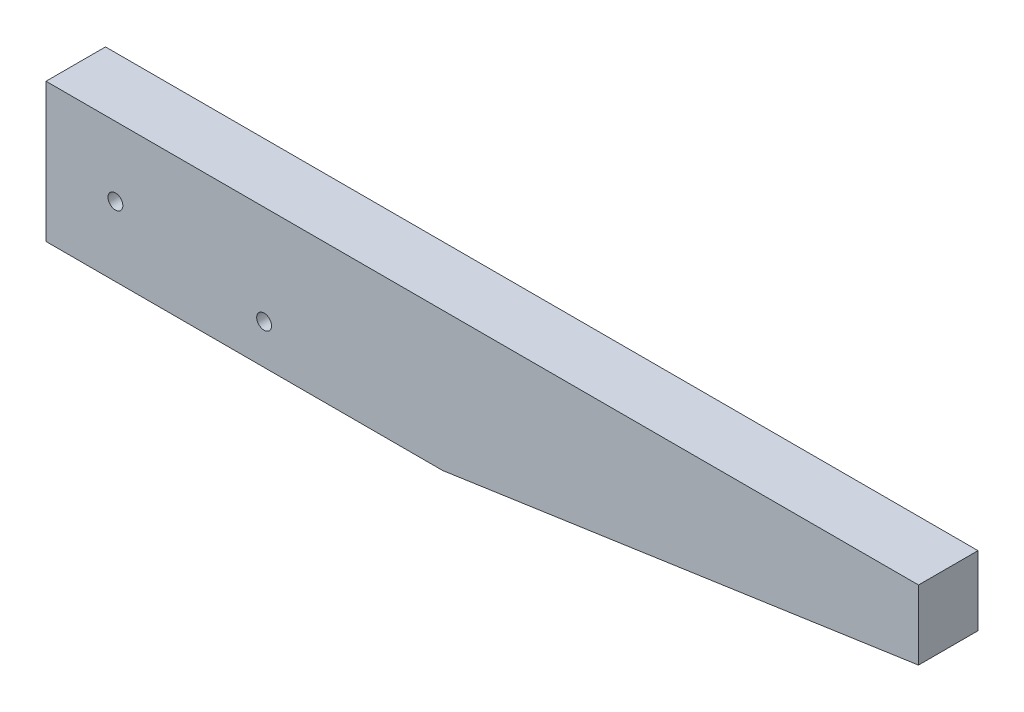
ISO-10303-21;
HEADER;
FILE_DESCRIPTION(('STEP AP214'),'2;1');
FILE_NAME('part.step','',(''),(''),'','','');
FILE_SCHEMA(('AUTOMOTIVE_DESIGN { 1 0 10303 214 1 1 1 1 }'));
ENDSEC;
DATA;
#1=APPLICATION_CONTEXT('core data for automotive mechanical design processes');
#2=APPLICATION_PROTOCOL_DEFINITION('international standard','automotive_design',2000,#1);
#3=PRODUCT_CONTEXT('',#1,'mechanical');
#4=PRODUCT('Part','Part','',(#3));
#5=PRODUCT_RELATED_PRODUCT_CATEGORY('part','',(#4));
#6=PRODUCT_DEFINITION_FORMATION('','',#4);
#7=PRODUCT_DEFINITION_CONTEXT('part definition',#1,'design');
#8=PRODUCT_DEFINITION('design','',#6,#7);
#9=PRODUCT_DEFINITION_SHAPE('','',#8);
#10=(LENGTH_UNIT() NAMED_UNIT(*) SI_UNIT(.MILLI.,.METRE.));
#11=(NAMED_UNIT(*) PLANE_ANGLE_UNIT() SI_UNIT($,.RADIAN.));
#12=(NAMED_UNIT(*) SI_UNIT($,.STERADIAN.) SOLID_ANGLE_UNIT());
#13=UNCERTAINTY_MEASURE_WITH_UNIT(LENGTH_MEASURE(1.E-05),#10,'distance_accuracy_value','');
#14=(GEOMETRIC_REPRESENTATION_CONTEXT(3) GLOBAL_UNCERTAINTY_ASSIGNED_CONTEXT((#13)) GLOBAL_UNIT_ASSIGNED_CONTEXT((#10,
#11,#12)) REPRESENTATION_CONTEXT('',''));
#15=CARTESIAN_POINT('',(0.,0.,0.));
#16=DIRECTION('',(0.,0.,1.));
#17=DIRECTION('',(1.,0.,0.));
#18=AXIS2_PLACEMENT_3D('',#15,#16,#17);
#19=CARTESIAN_POINT('',(0.,0.,38.1));
#20=DIRECTION('',(0.,1.,0.));
#21=DIRECTION('',(0.,0.,1.));
#22=AXIS2_PLACEMENT_3D('',#19,#20,#21);
#23=PLANE('',#22);
#24=DIRECTION('',(0.,0.,1.));
#25=VECTOR('',#24,1.);
#26=CARTESIAN_POINT('',(254.,0.,0.));
#27=LINE('',#26,#25);
#28=CARTESIAN_POINT('',(254.,0.,0.));
#29=VERTEX_POINT('',#28);
#30=CARTESIAN_POINT('',(254.,0.,38.1));
#31=VERTEX_POINT('',#30);
#32=EDGE_CURVE('E54',#29,#31,#27,.T.);
#33=ORIENTED_EDGE('',*,*,#32,.T.);
#34=DIRECTION('',(1.,0.,0.));
#35=VECTOR('',#34,1.);
#36=CARTESIAN_POINT('',(0.,0.,38.1));
#37=LINE('',#36,#35);
#38=CARTESIAN_POINT('',(0.,0.,38.1));
#39=VERTEX_POINT('',#38);
#40=EDGE_CURVE('E85',#39,#31,#37,.T.);
#41=ORIENTED_EDGE('',*,*,#40,.F.);
#42=DIRECTION('',(0.,0.,-1.));
#43=VECTOR('',#42,1.);
#44=CARTESIAN_POINT('',(0.,0.,38.1));
#45=LINE('',#44,#43);
#46=CARTESIAN_POINT('',(0.,0.,0.));
#47=VERTEX_POINT('',#46);
#48=EDGE_CURVE('E11',#39,#47,#45,.T.);
#49=ORIENTED_EDGE('',*,*,#48,.T.);
#50=DIRECTION('',(1.,0.,0.));
#51=VECTOR('',#50,1.);
#52=CARTESIAN_POINT('',(0.,0.,0.));
#53=LINE('',#52,#51);
#54=EDGE_CURVE('E115',#47,#29,#53,.T.);
#55=ORIENTED_EDGE('',*,*,#54,.T.);
#56=EDGE_LOOP('',(#33,#41,#49,#55));
#57=FACE_BOUND('',#56,.T.);
#58=ADVANCED_FACE('F38',(#57),#23,.F.);
#59=CARTESIAN_POINT('',(558.8,0.,38.1));
#60=DIRECTION('',(-1.,0.,0.));
#61=DIRECTION('',(0.,0.,1.));
#62=AXIS2_PLACEMENT_3D('',#59,#60,#61);
#63=PLANE('',#62);
#64=DIRECTION('',(0.,0.,1.));
#65=VECTOR('',#64,1.);
#66=CARTESIAN_POINT('',(558.8,44.45,0.));
#67=LINE('',#66,#65);
#68=CARTESIAN_POINT('',(558.8,44.45,0.));
#69=VERTEX_POINT('',#68);
#70=CARTESIAN_POINT('',(558.8,44.45,38.1));
#71=VERTEX_POINT('',#70);
#72=EDGE_CURVE('E95',#69,#71,#67,.T.);
#73=ORIENTED_EDGE('',*,*,#72,.F.);
#74=DIRECTION('',(0.,1.,0.));
#75=VECTOR('',#74,1.);
#76=CARTESIAN_POINT('',(558.8,0.,0.));
#77=LINE('',#76,#75);
#78=CARTESIAN_POINT('',(558.8,88.9,0.));
#79=VERTEX_POINT('',#78);
#80=EDGE_CURVE('E107',#69,#79,#77,.T.);
#81=ORIENTED_EDGE('',*,*,#80,.T.);
#82=DIRECTION('',(0.,0.,-1.));
#83=VECTOR('',#82,1.);
#84=CARTESIAN_POINT('',(558.8,88.9,38.1));
#85=LINE('',#84,#83);
#86=CARTESIAN_POINT('',(558.8,88.9,38.1));
#87=VERTEX_POINT('',#86);
#88=EDGE_CURVE('E47',#87,#79,#85,.T.);
#89=ORIENTED_EDGE('',*,*,#88,.F.);
#90=DIRECTION('',(0.,1.,0.));
#91=VECTOR('',#90,1.);
#92=CARTESIAN_POINT('',(558.8,0.,38.1));
#93=LINE('',#92,#91);
#94=EDGE_CURVE('E108',#71,#87,#93,.T.);
#95=ORIENTED_EDGE('',*,*,#94,.F.);
#96=EDGE_LOOP('',(#73,#81,#89,#95));
#97=FACE_BOUND('',#96,.T.);
#98=ADVANCED_FACE('F105',(#97),#63,.F.);
#99=CARTESIAN_POINT('',(0.,0.,38.1));
#100=DIRECTION('',(0.,0.,-1.));
#101=DIRECTION('',(-1.,0.,0.));
#102=AXIS2_PLACEMENT_3D('',#99,#100,#101);
#103=PLANE('',#102);
#104=CARTESIAN_POINT('',(139.7,25.4,38.1));
#105=DIRECTION('',(0.,0.,1.));
#106=DIRECTION('',(1.,0.,0.));
#107=AXIS2_PLACEMENT_3D('',#104,#105,#106);
#108=CIRCLE('',#107,4.76250000000001);
#109=CARTESIAN_POINT('',(144.4625,25.4,38.1));
#110=VERTEX_POINT('',#109);
#111=EDGE_CURVE('E170',#110,#110,#108,.T.);
#112=ORIENTED_EDGE('',*,*,#111,.F.);
#113=EDGE_LOOP('',(#112));
#114=FACE_BOUND('',#113,.T.);
#115=CARTESIAN_POINT('',(44.45,44.45,38.1));
#116=DIRECTION('',(0.,0.,1.));
#117=DIRECTION('',(1.,0.,0.));
#118=AXIS2_PLACEMENT_3D('',#115,#116,#117);
#119=CIRCLE('',#118,4.7625);
#120=CARTESIAN_POINT('',(49.2125,44.45,38.1));
#121=VERTEX_POINT('',#120);
#122=EDGE_CURVE('E174',#121,#121,#119,.T.);
#123=ORIENTED_EDGE('',*,*,#122,.F.);
#124=EDGE_LOOP('',(#123));
#125=FACE_BOUND('',#124,.T.);
#126=DIRECTION('',(0.989532981063282,0.144306893071729,0.));
#127=VECTOR('',#126,1.);
#128=CARTESIAN_POINT('',(5.28941776455589,-36.2702932426689,38.1));
#129=LINE('',#128,#127);
#130=EDGE_CURVE('E101',#31,#71,#129,.T.);
#131=ORIENTED_EDGE('',*,*,#130,.T.);
#132=ORIENTED_EDGE('',*,*,#94,.T.);
#133=DIRECTION('',(-1.,0.,0.));
#134=VECTOR('',#133,1.);
#135=CARTESIAN_POINT('',(0.,88.9,38.1));
#136=LINE('',#135,#134);
#137=CARTESIAN_POINT('',(0.,88.9,38.1));
#138=VERTEX_POINT('',#137);
#139=EDGE_CURVE('E63',#87,#138,#136,.T.);
#140=ORIENTED_EDGE('',*,*,#139,.T.);
#141=DIRECTION('',(0.,-1.,0.));
#142=VECTOR('',#141,1.);
#143=CARTESIAN_POINT('',(0.,0.,38.1));
#144=LINE('',#143,#142);
#145=EDGE_CURVE('E119',#138,#39,#144,.T.);
#146=ORIENTED_EDGE('',*,*,#145,.T.);
#147=ORIENTED_EDGE('',*,*,#40,.T.);
#148=EDGE_LOOP('',(#131,#132,#140,#146,#147));
#149=FACE_BOUND('',#148,.T.);
#150=ADVANCED_FACE('F142',(#114,#125,#149),#103,.F.);
#151=CARTESIAN_POINT('',(0.,0.,0.));
#152=DIRECTION('',(0.,0.,-1.));
#153=DIRECTION('',(-1.,0.,0.));
#154=AXIS2_PLACEMENT_3D('',#151,#152,#153);
#155=PLANE('',#154);
#156=CARTESIAN_POINT('',(139.7,25.4,0.));
#157=DIRECTION('',(0.,0.,1.));
#158=DIRECTION('',(1.,0.,0.));
#159=AXIS2_PLACEMENT_3D('',#156,#157,#158);
#160=CIRCLE('',#159,4.76250000000001);
#161=CARTESIAN_POINT('',(144.4625,25.4,0.));
#162=VERTEX_POINT('',#161);
#163=EDGE_CURVE('E167',#162,#162,#160,.T.);
#164=ORIENTED_EDGE('',*,*,#163,.T.);
#165=EDGE_LOOP('',(#164));
#166=FACE_BOUND('',#165,.T.);
#167=CARTESIAN_POINT('',(44.45,44.45,0.));
#168=DIRECTION('',(0.,0.,-1.));
#169=DIRECTION('',(-1.,0.,0.));
#170=AXIS2_PLACEMENT_3D('',#167,#168,#169);
#171=CIRCLE('',#170,4.76249999999999);
#172=CARTESIAN_POINT('',(39.6875,44.45,0.));
#173=VERTEX_POINT('',#172);
#174=EDGE_CURVE('E180',#173,#173,#171,.T.);
#175=ORIENTED_EDGE('',*,*,#174,.F.);
#176=EDGE_LOOP('',(#175));
#177=FACE_BOUND('',#176,.T.);
#178=ORIENTED_EDGE('',*,*,#80,.F.);
#179=DIRECTION('',(0.989532981063282,0.144306893071729,0.));
#180=VECTOR('',#179,1.);
#181=CARTESIAN_POINT('',(5.28941776455589,-36.2702932426689,0.));
#182=LINE('',#181,#180);
#183=EDGE_CURVE('E92',#29,#69,#182,.T.);
#184=ORIENTED_EDGE('',*,*,#183,.F.);
#185=ORIENTED_EDGE('',*,*,#54,.F.);
#186=DIRECTION('',(0.,-1.,0.));
#187=VECTOR('',#186,1.);
#188=CARTESIAN_POINT('',(0.,0.,0.));
#189=LINE('',#188,#187);
#190=CARTESIAN_POINT('',(0.,88.9,0.));
#191=VERTEX_POINT('',#190);
#192=EDGE_CURVE('E110',#191,#47,#189,.T.);
#193=ORIENTED_EDGE('',*,*,#192,.F.);
#194=DIRECTION('',(-1.,0.,0.));
#195=VECTOR('',#194,1.);
#196=CARTESIAN_POINT('',(0.,88.9,0.));
#197=LINE('',#196,#195);
#198=EDGE_CURVE('E80',#79,#191,#197,.T.);
#199=ORIENTED_EDGE('',*,*,#198,.F.);
#200=EDGE_LOOP('',(#178,#184,#185,#193,#199));
#201=FACE_BOUND('',#200,.T.);
#202=ADVANCED_FACE('F112',(#166,#177,#201),#155,.T.);
#203=CARTESIAN_POINT('',(0.,0.,38.1));
#204=DIRECTION('',(1.,0.,0.));
#205=DIRECTION('',(0.,0.,-1.));
#206=AXIS2_PLACEMENT_3D('',#203,#204,#205);
#207=PLANE('',#206);
#208=ORIENTED_EDGE('',*,*,#192,.T.);
#209=ORIENTED_EDGE('',*,*,#48,.F.);
#210=ORIENTED_EDGE('',*,*,#145,.F.);
#211=DIRECTION('',(0.,0.,-1.));
#212=VECTOR('',#211,1.);
#213=CARTESIAN_POINT('',(0.,88.9,38.1));
#214=LINE('',#213,#212);
#215=EDGE_CURVE('E124',#138,#191,#214,.T.);
#216=ORIENTED_EDGE('',*,*,#215,.T.);
#217=EDGE_LOOP('',(#208,#209,#210,#216));
#218=FACE_BOUND('',#217,.T.);
#219=ADVANCED_FACE('F40',(#218),#207,.F.);
#220=CARTESIAN_POINT('',(0.,88.9,38.1));
#221=DIRECTION('',(0.,-1.,0.));
#222=DIRECTION('',(0.,0.,-1.));
#223=AXIS2_PLACEMENT_3D('',#220,#221,#222);
#224=PLANE('',#223);
#225=ORIENTED_EDGE('',*,*,#198,.T.);
#226=ORIENTED_EDGE('',*,*,#215,.F.);
#227=ORIENTED_EDGE('',*,*,#139,.F.);
#228=ORIENTED_EDGE('',*,*,#88,.T.);
#229=EDGE_LOOP('',(#225,#226,#227,#228));
#230=FACE_BOUND('',#229,.T.);
#231=ADVANCED_FACE('F127',(#230),#224,.F.);
#232=CARTESIAN_POINT('',(5.28941776455589,-36.2702932426689,0.));
#233=DIRECTION('',(0.144306893071729,-0.989532981063282,0.));
#234=DIRECTION('',(0.989532981063282,0.144306893071729,0.));
#235=AXIS2_PLACEMENT_3D('',#232,#233,#234);
#236=PLANE('',#235);
#237=ORIENTED_EDGE('',*,*,#130,.F.);
#238=ORIENTED_EDGE('',*,*,#32,.F.);
#239=ORIENTED_EDGE('',*,*,#183,.T.);
#240=ORIENTED_EDGE('',*,*,#72,.T.);
#241=EDGE_LOOP('',(#237,#238,#239,#240));
#242=FACE_BOUND('',#241,.T.);
#243=ADVANCED_FACE('F94',(#242),#236,.T.);
#244=CARTESIAN_POINT('',(44.45,44.45,38.1));
#245=DIRECTION('',(0.,0.,1.));
#246=DIRECTION('',(1.,0.,0.));
#247=AXIS2_PLACEMENT_3D('',#244,#245,#246);
#248=CYLINDRICAL_SURFACE('',#247,4.76249999999999);
#249=ORIENTED_EDGE('',*,*,#174,.T.);
#250=EDGE_LOOP('',(#249));
#251=FACE_BOUND('',#250,.T.);
#252=ORIENTED_EDGE('',*,*,#122,.T.);
#253=EDGE_LOOP('',(#252));
#254=FACE_BOUND('',#253,.T.);
#255=ADVANCED_FACE('F155',(#251,#254),#248,.F.);
#256=CARTESIAN_POINT('',(139.7,25.4,0.));
#257=DIRECTION('',(0.,0.,1.));
#258=DIRECTION('',(1.,0.,0.));
#259=AXIS2_PLACEMENT_3D('',#256,#257,#258);
#260=CYLINDRICAL_SURFACE('',#259,4.76250000000001);
#261=CARTESIAN_POINT('',(144.4625,25.4,0.));
#262=CARTESIAN_POINT('',(144.4625,25.4,0.396875));
#263=CARTESIAN_POINT('',(144.4625,25.4,0.79375));
#264=CARTESIAN_POINT('',(144.4625,25.4,1.5875));
#265=CARTESIAN_POINT('',(144.4625,25.4,1.984375));
#266=CARTESIAN_POINT('',(144.4625,25.4,2.778125));
#267=CARTESIAN_POINT('',(144.4625,25.4,3.175));
#268=CARTESIAN_POINT('',(144.4625,25.4,3.96875));
#269=CARTESIAN_POINT('',(144.4625,25.4,4.365625));
#270=CARTESIAN_POINT('',(144.4625,25.4,5.159375));
#271=CARTESIAN_POINT('',(144.4625,25.4,5.55625));
#272=CARTESIAN_POINT('',(144.4625,25.4,6.35));
#273=CARTESIAN_POINT('',(144.4625,25.4,6.746875));
#274=CARTESIAN_POINT('',(144.4625,25.4,7.540625));
#275=CARTESIAN_POINT('',(144.4625,25.4,7.9375));
#276=CARTESIAN_POINT('',(144.4625,25.4,8.73125));
#277=CARTESIAN_POINT('',(144.4625,25.4,9.128125));
#278=CARTESIAN_POINT('',(144.4625,25.4,9.921875));
#279=CARTESIAN_POINT('',(144.4625,25.4,10.31875));
#280=CARTESIAN_POINT('',(144.4625,25.4,11.1125));
#281=CARTESIAN_POINT('',(144.4625,25.4,11.509375));
#282=CARTESIAN_POINT('',(144.4625,25.4,12.303125));
#283=CARTESIAN_POINT('',(144.4625,25.4,12.7));
#284=CARTESIAN_POINT('',(144.4625,25.4,13.49375));
#285=CARTESIAN_POINT('',(144.4625,25.4,13.890625));
#286=CARTESIAN_POINT('',(144.4625,25.4,14.684375));
#287=CARTESIAN_POINT('',(144.4625,25.4,15.08125));
#288=CARTESIAN_POINT('',(144.4625,25.4,15.875));
#289=CARTESIAN_POINT('',(144.4625,25.4,16.271875));
#290=CARTESIAN_POINT('',(144.4625,25.4,17.065625));
#291=CARTESIAN_POINT('',(144.4625,25.4,17.4625));
#292=CARTESIAN_POINT('',(144.4625,25.4,18.25625));
#293=CARTESIAN_POINT('',(144.4625,25.4,18.653125));
#294=CARTESIAN_POINT('',(144.4625,25.4,19.446875));
#295=CARTESIAN_POINT('',(144.4625,25.4,19.84375));
#296=CARTESIAN_POINT('',(144.4625,25.4,20.6375));
#297=CARTESIAN_POINT('',(144.4625,25.4,21.034375));
#298=CARTESIAN_POINT('',(144.4625,25.4,21.828125));
#299=CARTESIAN_POINT('',(144.4625,25.4,22.225));
#300=CARTESIAN_POINT('',(144.4625,25.4,23.01875));
#301=CARTESIAN_POINT('',(144.4625,25.4,23.415625));
#302=CARTESIAN_POINT('',(144.4625,25.4,24.209375));
#303=CARTESIAN_POINT('',(144.4625,25.4,24.60625));
#304=CARTESIAN_POINT('',(144.4625,25.4,25.4));
#305=CARTESIAN_POINT('',(144.4625,25.4,25.796875));
#306=CARTESIAN_POINT('',(144.4625,25.4,26.590625));
#307=CARTESIAN_POINT('',(144.4625,25.4,26.9875));
#308=CARTESIAN_POINT('',(144.4625,25.4,27.78125));
#309=CARTESIAN_POINT('',(144.4625,25.4,28.178125));
#310=CARTESIAN_POINT('',(144.4625,25.4,28.971875));
#311=CARTESIAN_POINT('',(144.4625,25.4,29.36875));
#312=CARTESIAN_POINT('',(144.4625,25.4,30.1625));
#313=CARTESIAN_POINT('',(144.4625,25.4,30.559375));
#314=CARTESIAN_POINT('',(144.4625,25.4,31.353125));
#315=CARTESIAN_POINT('',(144.4625,25.4,31.75));
#316=CARTESIAN_POINT('',(144.4625,25.4,32.54375));
#317=CARTESIAN_POINT('',(144.4625,25.4,32.940625));
#318=CARTESIAN_POINT('',(144.4625,25.4,33.734375));
#319=CARTESIAN_POINT('',(144.4625,25.4,34.13125));
#320=CARTESIAN_POINT('',(144.4625,25.4,34.925));
#321=CARTESIAN_POINT('',(144.4625,25.4,35.321875));
#322=CARTESIAN_POINT('',(144.4625,25.4,36.115625));
#323=CARTESIAN_POINT('',(144.4625,25.4,36.5125));
#324=CARTESIAN_POINT('',(144.4625,25.4,37.30625));
#325=CARTESIAN_POINT('',(144.4625,25.4,37.703125));
#326=CARTESIAN_POINT('',(144.4625,25.4,38.1));
#327=B_SPLINE_CURVE_WITH_KNOTS('',3,(#261,#262,#263,#264,#265,#266,#267,#268,#269,#270,#271,
#272,#273,#274,#275,#276,#277,#278,#279,#280,#281,#282,#283,#284,#285,#286,#287,#288,#289,#290,
#291,#292,#293,#294,#295,#296,#297,#298,#299,#300,#301,#302,#303,#304,#305,#306,#307,#308,#309,
#310,#311,#312,#313,#314,#315,#316,#317,#318,#319,#320,#321,#322,#323,#324,#325,#326),
.UNSPECIFIED.,.F.,.F.,(4,2,2,2,2,2,2,2,2,2,2,2,2,2,2,2,2,2,2,2,2,2,2,2,2,2,2,2,2,2,2,2,4),(0.,
1.190625,2.38125,3.571875,4.7625,5.953125,7.14375,8.334375,9.525,10.715625,11.90625,13.096875,
14.2875,15.478125,16.66875,17.859375,19.05,20.240625,21.43125,22.621875,23.8125,25.003125,
26.19375,27.384375,28.575,29.765625,30.95625,32.146875,33.3375,34.528125,35.71875,36.909375,
38.1),.UNSPECIFIED.);
#328=EDGE_CURVE('BSEAM158',#162,#110,#327,.T.);
#329=ORIENTED_EDGE('',*,*,#163,.F.);
#330=ORIENTED_EDGE('',*,*,#111,.T.);
#331=ORIENTED_EDGE('',*,*,#328,.T.);
#332=ORIENTED_EDGE('',*,*,#328,.F.);
#333=EDGE_LOOP('',(#329,#331,#330,#332));
#334=FACE_BOUND('',#333,.T.);
#335=ADVANCED_FACE('F158',(#334),#260,.F.);
#336=CLOSED_SHELL('',(#58,#98,#150,#202,#219,#231,#243,#255,#335));
#337=MANIFOLD_SOLID_BREP('B2',#336);
#338=ADVANCED_BREP_SHAPE_REPRESENTATION('',(#18,#337),#14);
#339=SHAPE_DEFINITION_REPRESENTATION(#9,#338);
ENDSEC;
END-ISO-10303-21;
